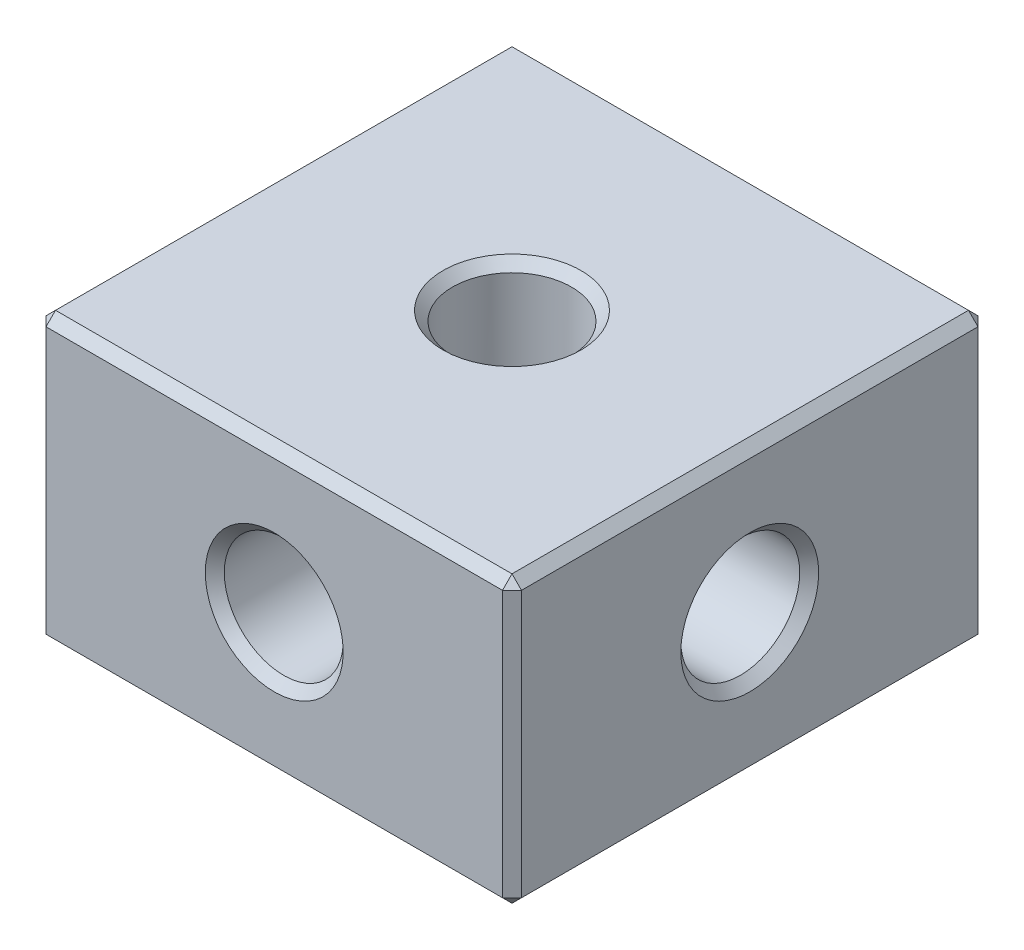
ISO-10303-21;
HEADER;
FILE_DESCRIPTION(('STEP AP214'),'2;1');
FILE_NAME('part.step','',(''),(''),'','','');
FILE_SCHEMA(('AUTOMOTIVE_DESIGN { 1 0 10303 214 1 1 1 1 }'));
ENDSEC;
DATA;
#1=APPLICATION_CONTEXT('core data for automotive mechanical design processes');
#2=APPLICATION_PROTOCOL_DEFINITION('international standard','automotive_design',2000,#1);
#3=PRODUCT_CONTEXT('',#1,'mechanical');
#4=PRODUCT('Part','Part','',(#3));
#5=PRODUCT_RELATED_PRODUCT_CATEGORY('part','',(#4));
#6=PRODUCT_DEFINITION_FORMATION('','',#4);
#7=PRODUCT_DEFINITION_CONTEXT('part definition',#1,'design');
#8=PRODUCT_DEFINITION('design','',#6,#7);
#9=PRODUCT_DEFINITION_SHAPE('','',#8);
#10=(LENGTH_UNIT() NAMED_UNIT(*) SI_UNIT(.MILLI.,.METRE.));
#11=(NAMED_UNIT(*) PLANE_ANGLE_UNIT() SI_UNIT($,.RADIAN.));
#12=(NAMED_UNIT(*) SI_UNIT($,.STERADIAN.) SOLID_ANGLE_UNIT());
#13=UNCERTAINTY_MEASURE_WITH_UNIT(LENGTH_MEASURE(1.E-05),#10,'distance_accuracy_value','');
#14=(GEOMETRIC_REPRESENTATION_CONTEXT(3) GLOBAL_UNCERTAINTY_ASSIGNED_CONTEXT((#13)) GLOBAL_UNIT_ASSIGNED_CONTEXT((#10,
#11,#12)) REPRESENTATION_CONTEXT('',''));
#15=CARTESIAN_POINT('',(0.,0.,0.));
#16=DIRECTION('',(0.,0.,1.));
#17=DIRECTION('',(1.,0.,0.));
#18=AXIS2_PLACEMENT_3D('',#15,#16,#17);
#19=CARTESIAN_POINT('',(0.,0.,5.));
#20=DIRECTION('',(0.,0.,1.));
#21=DIRECTION('',(1.,0.,0.));
#22=AXIS2_PLACEMENT_3D('',#19,#20,#21);
#23=CYLINDRICAL_SURFACE('',#22,1.25);
#24=CARTESIAN_POINT('',(0.,0.,4.8));
#25=DIRECTION('',(0.,0.,-1.));
#26=DIRECTION('',(-1.,0.,0.));
#27=AXIS2_PLACEMENT_3D('',#24,#25,#26);
#28=CIRCLE('',#27,1.25);
#29=CARTESIAN_POINT('',(-1.25,0.,4.8));
#30=VERTEX_POINT('',#29);
#31=EDGE_CURVE('E249',#30,#30,#28,.F.);
#32=ORIENTED_EDGE('',*,*,#31,.T.);
#33=EDGE_LOOP('',(#32));
#34=FACE_BOUND('',#33,.T.);
#35=CARTESIAN_POINT('',(0.,0.,0.));
#36=DIRECTION('',(0.,0.707106781186547,0.707106781186547));
#37=DIRECTION('',(0.,-0.707106781186547,0.707106781186547));
#38=AXIS2_PLACEMENT_3D('',#35,#36,#37);
#39=ELLIPSE('',#38,1.76776695296636,1.25);
#40=CARTESIAN_POINT('',(0.883883476483181,-0.883883476483181,0.883883476483181));
#41=VERTEX_POINT('',#40);
#42=CARTESIAN_POINT('',(-0.88388347648318,-0.88388347648318,0.88388347648318));
#43=VERTEX_POINT('',#42);
#44=EDGE_CURVE('E181',#41,#43,#39,.F.);
#45=ORIENTED_EDGE('',*,*,#44,.T.);
#46=CARTESIAN_POINT('',(0.,0.,0.));
#47=DIRECTION('',(0.707106781186548,0.,0.707106781186547));
#48=DIRECTION('',(-0.707106781186547,0.,0.707106781186547));
#49=AXIS2_PLACEMENT_3D('',#46,#47,#48);
#50=ELLIPSE('',#49,1.76776695296636,1.25);
#51=CARTESIAN_POINT('',(-0.88388347648318,0.88388347648318,0.88388347648318));
#52=VERTEX_POINT('',#51);
#53=EDGE_CURVE('E176',#43,#52,#50,.F.);
#54=ORIENTED_EDGE('',*,*,#53,.T.);
#55=CARTESIAN_POINT('',(0.,0.,0.));
#56=DIRECTION('',(0.,-0.707106781186547,0.707106781186547));
#57=DIRECTION('',(0.,0.707106781186547,0.707106781186547));
#58=AXIS2_PLACEMENT_3D('',#55,#56,#57);
#59=ELLIPSE('',#58,1.76776695296636,1.25);
#60=CARTESIAN_POINT('',(0.88388347648318,0.88388347648318,0.88388347648318));
#61=VERTEX_POINT('',#60);
#62=EDGE_CURVE('E175',#52,#61,#59,.F.);
#63=ORIENTED_EDGE('',*,*,#62,.T.);
#64=CARTESIAN_POINT('',(0.,0.,0.));
#65=DIRECTION('',(-0.707106781186547,0.,0.707106781186547));
#66=DIRECTION('',(0.707106781186548,0.,0.707106781186547));
#67=AXIS2_PLACEMENT_3D('',#64,#65,#66);
#68=ELLIPSE('',#67,1.76776695296636,1.25);
#69=EDGE_CURVE('E879',#61,#41,#68,.F.);
#70=ORIENTED_EDGE('',*,*,#69,.T.);
#71=EDGE_LOOP('',(#45,#54,#63,#70));
#72=FACE_BOUND('',#71,.T.);
#73=ADVANCED_FACE('F42',(#34,#72),#23,.F.);
#74=CARTESIAN_POINT('',(5.,3.,-5.));
#75=DIRECTION('',(-1.,0.,0.));
#76=DIRECTION('',(0.,0.,1.));
#77=AXIS2_PLACEMENT_3D('',#74,#75,#76);
#78=PLANE('',#77);
#79=CARTESIAN_POINT('',(5.,0.,0.));
#80=DIRECTION('',(-1.,0.,0.));
#81=DIRECTION('',(0.,0.,1.));
#82=AXIS2_PLACEMENT_3D('',#79,#80,#81);
#83=CIRCLE('',#82,1.44999999999999);
#84=CARTESIAN_POINT('',(5.,0.,1.44999999999999));
#85=VERTEX_POINT('',#84);
#86=EDGE_CURVE('E246',#85,#85,#83,.T.);
#87=ORIENTED_EDGE('',*,*,#86,.T.);
#88=EDGE_LOOP('',(#87));
#89=FACE_BOUND('',#88,.T.);
#90=DIRECTION('',(0.,0.,-1.));
#91=VECTOR('',#90,1.);
#92=CARTESIAN_POINT('',(5.,-2.8,-5.));
#93=LINE('',#92,#91);
#94=CARTESIAN_POINT('',(5.,-2.8,4.8));
#95=VERTEX_POINT('',#94);
#96=CARTESIAN_POINT('',(5.,-2.8,-4.8));
#97=VERTEX_POINT('',#96);
#98=EDGE_CURVE('E241',#95,#97,#93,.T.);
#99=ORIENTED_EDGE('',*,*,#98,.T.);
#100=DIRECTION('',(0.,1.,0.));
#101=VECTOR('',#100,1.);
#102=CARTESIAN_POINT('',(5.,3.,-4.8));
#103=LINE('',#102,#101);
#104=CARTESIAN_POINT('',(5.,2.8,-4.8));
#105=VERTEX_POINT('',#104);
#106=EDGE_CURVE('E243',#97,#105,#103,.T.);
#107=ORIENTED_EDGE('',*,*,#106,.T.);
#108=DIRECTION('',(0.,0.,1.));
#109=VECTOR('',#108,1.);
#110=CARTESIAN_POINT('',(5.,2.8,5.));
#111=LINE('',#110,#109);
#112=CARTESIAN_POINT('',(5.,2.8,4.8));
#113=VERTEX_POINT('',#112);
#114=EDGE_CURVE('E237',#105,#113,#111,.T.);
#115=ORIENTED_EDGE('',*,*,#114,.T.);
#116=DIRECTION('',(0.,-1.,0.));
#117=VECTOR('',#116,1.);
#118=CARTESIAN_POINT('',(5.,3.,4.8));
#119=LINE('',#118,#117);
#120=EDGE_CURVE('E239',#113,#95,#119,.T.);
#121=ORIENTED_EDGE('',*,*,#120,.T.);
#122=EDGE_LOOP('',(#99,#107,#115,#121));
#123=FACE_BOUND('',#122,.T.);
#124=ADVANCED_FACE('F350',(#89,#123),#78,.F.);
#125=CARTESIAN_POINT('',(-5.,3.,-5.));
#126=DIRECTION('',(0.,0.,1.));
#127=DIRECTION('',(1.,0.,0.));
#128=AXIS2_PLACEMENT_3D('',#125,#126,#127);
#129=PLANE('',#128);
#130=CARTESIAN_POINT('',(0.,0.,-5.));
#131=DIRECTION('',(0.,0.,1.));
#132=DIRECTION('',(1.,0.,0.));
#133=AXIS2_PLACEMENT_3D('',#130,#131,#132);
#134=CIRCLE('',#133,1.45);
#135=CARTESIAN_POINT('',(1.45,0.,-5.));
#136=VERTEX_POINT('',#135);
#137=EDGE_CURVE('E228',#136,#136,#134,.T.);
#138=ORIENTED_EDGE('',*,*,#137,.T.);
#139=EDGE_LOOP('',(#138));
#140=FACE_BOUND('',#139,.T.);
#141=DIRECTION('',(-1.,0.,0.));
#142=VECTOR('',#141,1.);
#143=CARTESIAN_POINT('',(-5.,-2.8,-5.));
#144=LINE('',#143,#142);
#145=CARTESIAN_POINT('',(4.8,-2.8,-5.));
#146=VERTEX_POINT('',#145);
#147=CARTESIAN_POINT('',(-4.8,-2.8,-5.));
#148=VERTEX_POINT('',#147);
#149=EDGE_CURVE('E223',#146,#148,#144,.T.);
#150=ORIENTED_EDGE('',*,*,#149,.T.);
#151=DIRECTION('',(0.,1.,0.));
#152=VECTOR('',#151,1.);
#153=CARTESIAN_POINT('',(-4.8,3.,-5.));
#154=LINE('',#153,#152);
#155=CARTESIAN_POINT('',(-4.8,2.8,-5.));
#156=VERTEX_POINT('',#155);
#157=EDGE_CURVE('E225',#148,#156,#154,.T.);
#158=ORIENTED_EDGE('',*,*,#157,.T.);
#159=DIRECTION('',(1.,0.,0.));
#160=VECTOR('',#159,1.);
#161=CARTESIAN_POINT('',(5.,2.8,-5.));
#162=LINE('',#161,#160);
#163=CARTESIAN_POINT('',(4.8,2.8,-5.));
#164=VERTEX_POINT('',#163);
#165=EDGE_CURVE('E219',#156,#164,#162,.T.);
#166=ORIENTED_EDGE('',*,*,#165,.T.);
#167=DIRECTION('',(0.,-1.,0.));
#168=VECTOR('',#167,1.);
#169=CARTESIAN_POINT('',(4.8,3.,-5.));
#170=LINE('',#169,#168);
#171=EDGE_CURVE('E221',#164,#146,#170,.T.);
#172=ORIENTED_EDGE('',*,*,#171,.T.);
#173=EDGE_LOOP('',(#150,#158,#166,#172));
#174=FACE_BOUND('',#173,.T.);
#175=ADVANCED_FACE('F371',(#140,#174),#129,.F.);
#176=CARTESIAN_POINT('',(-5.,3.,-5.));
#177=DIRECTION('',(1.,0.,0.));
#178=DIRECTION('',(0.,0.,-1.));
#179=AXIS2_PLACEMENT_3D('',#176,#177,#178);
#180=PLANE('',#179);
#181=CARTESIAN_POINT('',(-5.,0.,0.));
#182=DIRECTION('',(1.,0.,0.));
#183=DIRECTION('',(0.,0.,-1.));
#184=AXIS2_PLACEMENT_3D('',#181,#182,#183);
#185=CIRCLE('',#184,1.44999999999999);
#186=CARTESIAN_POINT('',(-5.,0.,-1.44999999999999));
#187=VERTEX_POINT('',#186);
#188=EDGE_CURVE('E213',#187,#187,#185,.T.);
#189=ORIENTED_EDGE('',*,*,#188,.T.);
#190=EDGE_LOOP('',(#189));
#191=FACE_BOUND('',#190,.T.);
#192=DIRECTION('',(0.,-1.,0.));
#193=VECTOR('',#192,1.);
#194=CARTESIAN_POINT('',(-5.,3.,-4.8));
#195=LINE('',#194,#193);
#196=CARTESIAN_POINT('',(-5.,2.8,-4.8));
#197=VERTEX_POINT('',#196);
#198=CARTESIAN_POINT('',(-5.,-2.8,-4.8));
#199=VERTEX_POINT('',#198);
#200=EDGE_CURVE('E208',#197,#199,#195,.T.);
#201=ORIENTED_EDGE('',*,*,#200,.T.);
#202=DIRECTION('',(0.,0.,1.));
#203=VECTOR('',#202,1.);
#204=CARTESIAN_POINT('',(-5.,-2.8,-5.));
#205=LINE('',#204,#203);
#206=CARTESIAN_POINT('',(-5.,-2.8,4.8));
#207=VERTEX_POINT('',#206);
#208=EDGE_CURVE('E210',#199,#207,#205,.T.);
#209=ORIENTED_EDGE('',*,*,#208,.T.);
#210=DIRECTION('',(0.,1.,0.));
#211=VECTOR('',#210,1.);
#212=CARTESIAN_POINT('',(-5.,3.,4.8));
#213=LINE('',#212,#211);
#214=CARTESIAN_POINT('',(-5.,2.8,4.8));
#215=VERTEX_POINT('',#214);
#216=EDGE_CURVE('E206',#207,#215,#213,.T.);
#217=ORIENTED_EDGE('',*,*,#216,.T.);
#218=DIRECTION('',(0.,0.,-1.));
#219=VECTOR('',#218,1.);
#220=CARTESIAN_POINT('',(-5.,2.8,-5.));
#221=LINE('',#220,#219);
#222=EDGE_CURVE('E204',#215,#197,#221,.T.);
#223=ORIENTED_EDGE('',*,*,#222,.T.);
#224=EDGE_LOOP('',(#201,#209,#217,#223));
#225=FACE_BOUND('',#224,.T.);
#226=ADVANCED_FACE('F432',(#191,#225),#180,.F.);
#227=CARTESIAN_POINT('',(-5.,3.,5.));
#228=DIRECTION('',(0.,0.,-1.));
#229=DIRECTION('',(-1.,0.,0.));
#230=AXIS2_PLACEMENT_3D('',#227,#228,#229);
#231=PLANE('',#230);
#232=CARTESIAN_POINT('',(0.,0.,5.));
#233=DIRECTION('',(0.,0.,-1.));
#234=DIRECTION('',(-1.,0.,0.));
#235=AXIS2_PLACEMENT_3D('',#232,#233,#234);
#236=CIRCLE('',#235,1.45);
#237=CARTESIAN_POINT('',(-1.45,0.,5.));
#238=VERTEX_POINT('',#237);
#239=EDGE_CURVE('E261',#238,#238,#236,.T.);
#240=ORIENTED_EDGE('',*,*,#239,.T.);
#241=EDGE_LOOP('',(#240));
#242=FACE_BOUND('',#241,.T.);
#243=DIRECTION('',(-1.,0.,0.));
#244=VECTOR('',#243,1.);
#245=CARTESIAN_POINT('',(-5.,2.8,5.));
#246=LINE('',#245,#244);
#247=CARTESIAN_POINT('',(4.8,2.8,5.));
#248=VERTEX_POINT('',#247);
#249=CARTESIAN_POINT('',(-4.8,2.8,5.));
#250=VERTEX_POINT('',#249);
#251=EDGE_CURVE('E252',#248,#250,#246,.T.);
#252=ORIENTED_EDGE('',*,*,#251,.T.);
#253=DIRECTION('',(0.,-1.,0.));
#254=VECTOR('',#253,1.);
#255=CARTESIAN_POINT('',(-4.8,3.,5.));
#256=LINE('',#255,#254);
#257=CARTESIAN_POINT('',(-4.8,-2.8,5.));
#258=VERTEX_POINT('',#257);
#259=EDGE_CURVE('E258',#250,#258,#256,.T.);
#260=ORIENTED_EDGE('',*,*,#259,.T.);
#261=DIRECTION('',(1.,0.,0.));
#262=VECTOR('',#261,1.);
#263=CARTESIAN_POINT('',(-5.,-2.8,5.));
#264=LINE('',#263,#262);
#265=CARTESIAN_POINT('',(4.8,-2.8,5.));
#266=VERTEX_POINT('',#265);
#267=EDGE_CURVE('E256',#258,#266,#264,.T.);
#268=ORIENTED_EDGE('',*,*,#267,.T.);
#269=DIRECTION('',(0.,1.,0.));
#270=VECTOR('',#269,1.);
#271=CARTESIAN_POINT('',(4.8,3.,5.));
#272=LINE('',#271,#270);
#273=EDGE_CURVE('E254',#266,#248,#272,.T.);
#274=ORIENTED_EDGE('',*,*,#273,.T.);
#275=EDGE_LOOP('',(#252,#260,#268,#274));
#276=FACE_BOUND('',#275,.T.);
#277=ADVANCED_FACE('F437',(#242,#276),#231,.F.);
#278=CARTESIAN_POINT('',(0.,3.,0.));
#279=DIRECTION('',(0.,1.,0.));
#280=DIRECTION('',(0.,0.,1.));
#281=AXIS2_PLACEMENT_3D('',#278,#279,#280);
#282=PLANE('',#281);
#283=DIRECTION('',(0.,0.,1.));
#284=VECTOR('',#283,1.);
#285=CARTESIAN_POINT('',(-4.8,3.,5.));
#286=LINE('',#285,#284);
#287=CARTESIAN_POINT('',(-4.80000000000001,3.,-4.8));
#288=VERTEX_POINT('',#287);
#289=CARTESIAN_POINT('',(-4.8,3.,4.8));
#290=VERTEX_POINT('',#289);
#291=EDGE_CURVE('E60',#288,#290,#286,.T.);
#292=ORIENTED_EDGE('',*,*,#291,.T.);
#293=DIRECTION('',(1.,0.,0.));
#294=VECTOR('',#293,1.);
#295=CARTESIAN_POINT('',(5.,3.,4.8));
#296=LINE('',#295,#294);
#297=CARTESIAN_POINT('',(4.8,3.,4.8));
#298=VERTEX_POINT('',#297);
#299=EDGE_CURVE('E52',#290,#298,#296,.T.);
#300=ORIENTED_EDGE('',*,*,#299,.T.);
#301=DIRECTION('',(0.,0.,-1.));
#302=VECTOR('',#301,1.);
#303=CARTESIAN_POINT('',(4.8,3.,-5.));
#304=LINE('',#303,#302);
#305=CARTESIAN_POINT('',(4.8,3.,-4.8));
#306=VERTEX_POINT('',#305);
#307=EDGE_CURVE('E267',#298,#306,#304,.T.);
#308=ORIENTED_EDGE('',*,*,#307,.T.);
#309=DIRECTION('',(-1.,0.,0.));
#310=VECTOR('',#309,1.);
#311=CARTESIAN_POINT('',(-5.,3.,-4.8));
#312=LINE('',#311,#310);
#313=EDGE_CURVE('E65',#306,#288,#312,.T.);
#314=ORIENTED_EDGE('',*,*,#313,.T.);
#315=EDGE_LOOP('',(#292,#300,#308,#314));
#316=FACE_BOUND('',#315,.T.);
#317=CARTESIAN_POINT('',(0.,3.,0.));
#318=DIRECTION('',(0.,1.,0.));
#319=DIRECTION('',(0.,0.,1.));
#320=AXIS2_PLACEMENT_3D('',#317,#318,#319);
#321=CIRCLE('',#320,1.44999999999999);
#322=CARTESIAN_POINT('',(0.,3.,1.44999999999999));
#323=VERTEX_POINT('',#322);
#324=EDGE_CURVE('E264',#323,#323,#321,.F.);
#325=ORIENTED_EDGE('',*,*,#324,.T.);
#326=EDGE_LOOP('',(#325));
#327=FACE_BOUND('',#326,.T.);
#328=ADVANCED_FACE('F418',(#316,#327),#282,.T.);
#329=CARTESIAN_POINT('',(0.,-3.,0.));
#330=DIRECTION('',(0.,1.,0.));
#331=DIRECTION('',(0.,0.,1.));
#332=AXIS2_PLACEMENT_3D('',#329,#330,#331);
#333=PLANE('',#332);
#334=CARTESIAN_POINT('',(0.,-3.,0.));
#335=DIRECTION('',(0.,1.,0.));
#336=DIRECTION('',(0.,0.,1.));
#337=AXIS2_PLACEMENT_3D('',#334,#335,#336);
#338=CIRCLE('',#337,1.45);
#339=CARTESIAN_POINT('',(0.,-3.,-1.45));
#340=VERTEX_POINT('',#339);
#341=EDGE_CURVE('E198',#340,#340,#338,.T.);
#342=ORIENTED_EDGE('',*,*,#341,.T.);
#343=EDGE_LOOP('',(#342));
#344=FACE_BOUND('',#343,.T.);
#345=DIRECTION('',(-1.,0.,0.));
#346=VECTOR('',#345,1.);
#347=CARTESIAN_POINT('',(0.,-3.,4.8));
#348=LINE('',#347,#346);
#349=CARTESIAN_POINT('',(4.8,-3.,4.8));
#350=VERTEX_POINT('',#349);
#351=CARTESIAN_POINT('',(-4.8,-3.,4.8));
#352=VERTEX_POINT('',#351);
#353=EDGE_CURVE('E185',#350,#352,#348,.T.);
#354=ORIENTED_EDGE('',*,*,#353,.T.);
#355=DIRECTION('',(0.,0.,-1.));
#356=VECTOR('',#355,1.);
#357=CARTESIAN_POINT('',(-4.8,-3.,0.));
#358=LINE('',#357,#356);
#359=CARTESIAN_POINT('',(-4.8,-3.,-4.8));
#360=VERTEX_POINT('',#359);
#361=EDGE_CURVE('E195',#352,#360,#358,.T.);
#362=ORIENTED_EDGE('',*,*,#361,.T.);
#363=DIRECTION('',(1.,0.,0.));
#364=VECTOR('',#363,1.);
#365=CARTESIAN_POINT('',(0.,-3.,-4.8));
#366=LINE('',#365,#364);
#367=CARTESIAN_POINT('',(4.8,-3.,-4.8));
#368=VERTEX_POINT('',#367);
#369=EDGE_CURVE('E193',#360,#368,#366,.T.);
#370=ORIENTED_EDGE('',*,*,#369,.T.);
#371=DIRECTION('',(0.,0.,1.));
#372=VECTOR('',#371,1.);
#373=CARTESIAN_POINT('',(4.8,-3.,0.));
#374=LINE('',#373,#372);
#375=EDGE_CURVE('E191',#368,#350,#374,.T.);
#376=ORIENTED_EDGE('',*,*,#375,.T.);
#377=EDGE_LOOP('',(#354,#362,#370,#376));
#378=FACE_BOUND('',#377,.T.);
#379=ADVANCED_FACE('F410',(#344,#378),#333,.F.);
#380=CARTESIAN_POINT('',(0.,0.,-4.8));
#381=DIRECTION('',(0.,0.,1.));
#382=DIRECTION('',(1.,0.,0.));
#383=AXIS2_PLACEMENT_3D('',#380,#381,#382);
#384=CIRCLE('',#383,1.25);
#385=CARTESIAN_POINT('',(1.25,0.,-4.8));
#386=VERTEX_POINT('',#385);
#387=EDGE_CURVE('E231',#386,#386,#384,.F.);
#388=ORIENTED_EDGE('',*,*,#387,.T.);
#389=EDGE_LOOP('',(#388));
#390=FACE_BOUND('',#389,.T.);
#391=CARTESIAN_POINT('',(0.,0.,0.));
#392=DIRECTION('',(0.,-0.707106781186547,0.707106781186547));
#393=DIRECTION('',(0.,0.707106781186547,0.707106781186547));
#394=AXIS2_PLACEMENT_3D('',#391,#392,#393);
#395=ELLIPSE('',#394,1.76776695296636,1.25);
#396=CARTESIAN_POINT('',(-0.883883476483181,-0.883883476483181,-0.883883476483181));
#397=VERTEX_POINT('',#396);
#398=CARTESIAN_POINT('',(0.883883476483181,-0.883883476483181,-0.883883476483181));
#399=VERTEX_POINT('',#398);
#400=EDGE_CURVE('E182',#397,#399,#395,.T.);
#401=ORIENTED_EDGE('',*,*,#400,.T.);
#402=CARTESIAN_POINT('',(0.,0.,0.));
#403=DIRECTION('',(0.707106781186548,0.,0.707106781186547));
#404=DIRECTION('',(-0.707106781186547,0.,0.707106781186547));
#405=AXIS2_PLACEMENT_3D('',#402,#403,#404);
#406=ELLIPSE('',#405,1.76776695296636,1.25);
#407=CARTESIAN_POINT('',(0.88388347648318,0.88388347648318,-0.88388347648318));
#408=VERTEX_POINT('',#407);
#409=EDGE_CURVE('E180',#399,#408,#406,.T.);
#410=ORIENTED_EDGE('',*,*,#409,.T.);
#411=CARTESIAN_POINT('',(0.,0.,0.));
#412=DIRECTION('',(0.,0.707106781186547,0.707106781186547));
#413=DIRECTION('',(0.,-0.707106781186547,0.707106781186547));
#414=AXIS2_PLACEMENT_3D('',#411,#412,#413);
#415=ELLIPSE('',#414,1.76776695296636,1.25);
#416=CARTESIAN_POINT('',(-0.883883476483181,0.883883476483181,-0.883883476483181));
#417=VERTEX_POINT('',#416);
#418=EDGE_CURVE('E173',#408,#417,#415,.T.);
#419=ORIENTED_EDGE('',*,*,#418,.T.);
#420=CARTESIAN_POINT('',(0.,0.,0.));
#421=DIRECTION('',(-0.707106781186547,0.,0.707106781186547));
#422=DIRECTION('',(0.707106781186548,0.,0.707106781186547));
#423=AXIS2_PLACEMENT_3D('',#420,#421,#422);
#424=ELLIPSE('',#423,1.76776695296636,1.25);
#425=EDGE_CURVE('E156',#417,#397,#424,.T.);
#426=ORIENTED_EDGE('',*,*,#425,.T.);
#427=EDGE_LOOP('',(#401,#410,#419,#426));
#428=FACE_BOUND('',#427,.T.);
#429=ADVANCED_FACE('F179',(#390,#428),#23,.F.);
#430=CARTESIAN_POINT('',(0.,3.,0.));
#431=DIRECTION('',(0.,1.,0.));
#432=DIRECTION('',(0.,0.,1.));
#433=AXIS2_PLACEMENT_3D('',#430,#431,#432);
#434=CYLINDRICAL_SURFACE('',#433,1.24999999999999);
#435=CARTESIAN_POINT('',(0.,2.80000000000001,0.));
#436=DIRECTION('',(0.,1.,0.));
#437=DIRECTION('',(0.,0.,1.));
#438=AXIS2_PLACEMENT_3D('',#435,#436,#437);
#439=CIRCLE('',#438,1.24999999999999);
#440=CARTESIAN_POINT('',(0.,2.80000000000001,1.24999999999999));
#441=VERTEX_POINT('',#440);
#442=EDGE_CURVE('E11',#441,#441,#439,.T.);
#443=ORIENTED_EDGE('',*,*,#442,.T.);
#444=EDGE_LOOP('',(#443));
#445=FACE_BOUND('',#444,.T.);
#446=ORIENTED_EDGE('',*,*,#62,.F.);
#447=CARTESIAN_POINT('',(0.,0.,0.));
#448=DIRECTION('',(0.707106781186547,0.707106781186547,0.));
#449=DIRECTION('',(-0.707106781186547,0.707106781186547,0.));
#450=AXIS2_PLACEMENT_3D('',#447,#448,#449);
#451=ELLIPSE('',#450,1.76776695296636,1.24999999999999);
#452=EDGE_CURVE('E159',#52,#417,#451,.F.);
#453=ORIENTED_EDGE('',*,*,#452,.T.);
#454=ORIENTED_EDGE('',*,*,#418,.F.);
#455=CARTESIAN_POINT('',(0.,0.,0.));
#456=DIRECTION('',(-0.707106781186547,0.707106781186547,0.));
#457=DIRECTION('',(0.707106781186547,0.707106781186547,0.));
#458=AXIS2_PLACEMENT_3D('',#455,#456,#457);
#459=ELLIPSE('',#458,1.76776695296636,1.24999999999999);
#460=EDGE_CURVE('E880',#408,#61,#459,.F.);
#461=ORIENTED_EDGE('',*,*,#460,.T.);
#462=EDGE_LOOP('',(#446,#453,#454,#461));
#463=FACE_BOUND('',#462,.T.);
#464=ADVANCED_FACE('F171',(#445,#463),#434,.F.);
#465=CARTESIAN_POINT('',(0.,-2.8,0.));
#466=DIRECTION('',(0.,1.,0.));
#467=DIRECTION('',(0.,0.,1.));
#468=AXIS2_PLACEMENT_3D('',#465,#466,#467);
#469=CIRCLE('',#468,1.24999999999999);
#470=CARTESIAN_POINT('',(0.,-2.8,-1.24999999999999));
#471=VERTEX_POINT('',#470);
#472=EDGE_CURVE('E201',#471,#471,#469,.F.);
#473=ORIENTED_EDGE('',*,*,#472,.T.);
#474=EDGE_LOOP('',(#473));
#475=FACE_BOUND('',#474,.T.);
#476=ORIENTED_EDGE('',*,*,#44,.F.);
#477=CARTESIAN_POINT('',(0.,0.,0.));
#478=DIRECTION('',(0.707106781186547,0.707106781186547,0.));
#479=DIRECTION('',(-0.707106781186547,0.707106781186547,0.));
#480=AXIS2_PLACEMENT_3D('',#477,#478,#479);
#481=ELLIPSE('',#480,1.76776695296636,1.24999999999999);
#482=EDGE_CURVE('E882',#41,#399,#481,.T.);
#483=ORIENTED_EDGE('',*,*,#482,.T.);
#484=ORIENTED_EDGE('',*,*,#400,.F.);
#485=CARTESIAN_POINT('',(0.,0.,0.));
#486=DIRECTION('',(-0.707106781186547,0.707106781186547,0.));
#487=DIRECTION('',(0.707106781186547,0.707106781186547,0.));
#488=AXIS2_PLACEMENT_3D('',#485,#486,#487);
#489=ELLIPSE('',#488,1.76776695296636,1.24999999999999);
#490=EDGE_CURVE('E162',#397,#43,#489,.T.);
#491=ORIENTED_EDGE('',*,*,#490,.T.);
#492=EDGE_LOOP('',(#476,#483,#484,#491));
#493=FACE_BOUND('',#492,.T.);
#494=ADVANCED_FACE('F416',(#475,#493),#434,.F.);
#495=CARTESIAN_POINT('',(5.,0.,0.));
#496=DIRECTION('',(1.,0.,0.));
#497=DIRECTION('',(0.,0.,-1.));
#498=AXIS2_PLACEMENT_3D('',#495,#496,#497);
#499=CYLINDRICAL_SURFACE('',#498,1.24999999999999);
#500=CARTESIAN_POINT('',(-4.8,0.,0.));
#501=DIRECTION('',(1.,0.,0.));
#502=DIRECTION('',(0.,0.,-1.));
#503=AXIS2_PLACEMENT_3D('',#500,#501,#502);
#504=CIRCLE('',#503,1.24999999999999);
#505=CARTESIAN_POINT('',(-4.8,0.,-1.24999999999999));
#506=VERTEX_POINT('',#505);
#507=EDGE_CURVE('E216',#506,#506,#504,.F.);
#508=ORIENTED_EDGE('',*,*,#507,.T.);
#509=EDGE_LOOP('',(#508));
#510=FACE_BOUND('',#509,.T.);
#511=ORIENTED_EDGE('',*,*,#490,.F.);
#512=ORIENTED_EDGE('',*,*,#425,.F.);
#513=ORIENTED_EDGE('',*,*,#452,.F.);
#514=ORIENTED_EDGE('',*,*,#53,.F.);
#515=EDGE_LOOP('',(#511,#512,#513,#514));
#516=FACE_BOUND('',#515,.T.);
#517=ADVANCED_FACE('F158',(#510,#516),#499,.F.);
#518=CARTESIAN_POINT('',(4.80000000000001,0.,0.));
#519=DIRECTION('',(-1.,0.,0.));
#520=DIRECTION('',(0.,0.,1.));
#521=AXIS2_PLACEMENT_3D('',#518,#519,#520);
#522=CIRCLE('',#521,1.24999999999999);
#523=CARTESIAN_POINT('',(4.80000000000001,0.,1.24999999999999));
#524=VERTEX_POINT('',#523);
#525=EDGE_CURVE('E234',#524,#524,#522,.F.);
#526=ORIENTED_EDGE('',*,*,#525,.T.);
#527=EDGE_LOOP('',(#526));
#528=FACE_BOUND('',#527,.T.);
#529=ORIENTED_EDGE('',*,*,#69,.F.);
#530=ORIENTED_EDGE('',*,*,#460,.F.);
#531=ORIENTED_EDGE('',*,*,#409,.F.);
#532=ORIENTED_EDGE('',*,*,#482,.F.);
#533=EDGE_LOOP('',(#529,#530,#531,#532));
#534=FACE_BOUND('',#533,.T.);
#535=ADVANCED_FACE('F449',(#528,#534),#499,.F.);
#536=CARTESIAN_POINT('',(0.,-3.,0.));
#537=DIRECTION('',(0.,-1.,0.));
#538=DIRECTION('',(0.,0.,-1.));
#539=AXIS2_PLACEMENT_3D('',#536,#537,#538);
#540=CONICAL_SURFACE('',#539,1.45,0.785398163397445);
#541=CARTESIAN_POINT('',(0.,-2.8,-1.24999999999999));
#542=CARTESIAN_POINT('',(0.,-2.80208333333333,-1.25208333333333));
#543=CARTESIAN_POINT('',(0.,-2.80416666666666,-1.25416666666666));
#544=CARTESIAN_POINT('',(0.,-2.80833333333333,-1.25833333333333));
#545=CARTESIAN_POINT('',(0.,-2.81041666666666,-1.26041666666666));
#546=CARTESIAN_POINT('',(0.,-2.81458333333333,-1.26458333333333));
#547=CARTESIAN_POINT('',(0.,-2.81666666666666,-1.26666666666666));
#548=CARTESIAN_POINT('',(0.,-2.82083333333333,-1.27083333333333));
#549=CARTESIAN_POINT('',(0.,-2.82291666666666,-1.27291666666666));
#550=CARTESIAN_POINT('',(0.,-2.82708333333333,-1.27708333333333));
#551=CARTESIAN_POINT('',(0.,-2.82916666666666,-1.27916666666666));
#552=CARTESIAN_POINT('',(0.,-2.83333333333333,-1.28333333333333));
#553=CARTESIAN_POINT('',(0.,-2.83541666666666,-1.28541666666666));
#554=CARTESIAN_POINT('',(0.,-2.83958333333333,-1.28958333333333));
#555=CARTESIAN_POINT('',(0.,-2.84166666666666,-1.29166666666666));
#556=CARTESIAN_POINT('',(0.,-2.84583333333333,-1.29583333333333));
#557=CARTESIAN_POINT('',(0.,-2.84791666666666,-1.29791666666666));
#558=CARTESIAN_POINT('',(0.,-2.85208333333333,-1.30208333333333));
#559=CARTESIAN_POINT('',(0.,-2.85416666666666,-1.30416666666666));
#560=CARTESIAN_POINT('',(0.,-2.85833333333333,-1.30833333333333));
#561=CARTESIAN_POINT('',(0.,-2.86041666666666,-1.31041666666666));
#562=CARTESIAN_POINT('',(0.,-2.86458333333333,-1.31458333333333));
#563=CARTESIAN_POINT('',(0.,-2.86666666666666,-1.31666666666666));
#564=CARTESIAN_POINT('',(0.,-2.87083333333333,-1.32083333333333));
#565=CARTESIAN_POINT('',(0.,-2.87291666666666,-1.32291666666666));
#566=CARTESIAN_POINT('',(0.,-2.87708333333333,-1.32708333333333));
#567=CARTESIAN_POINT('',(0.,-2.87916666666666,-1.32916666666666));
#568=CARTESIAN_POINT('',(0.,-2.88333333333333,-1.33333333333333));
#569=CARTESIAN_POINT('',(0.,-2.88541666666666,-1.33541666666666));
#570=CARTESIAN_POINT('',(0.,-2.88958333333333,-1.33958333333333));
#571=CARTESIAN_POINT('',(0.,-2.89166666666666,-1.34166666666666));
#572=CARTESIAN_POINT('',(0.,-2.89583333333333,-1.34583333333333));
#573=CARTESIAN_POINT('',(0.,-2.89791666666666,-1.34791666666666));
#574=CARTESIAN_POINT('',(0.,-2.90208333333333,-1.35208333333333));
#575=CARTESIAN_POINT('',(0.,-2.90416666666666,-1.35416666666666));
#576=CARTESIAN_POINT('',(0.,-2.90833333333333,-1.35833333333333));
#577=CARTESIAN_POINT('',(0.,-2.91041666666666,-1.36041666666666));
#578=CARTESIAN_POINT('',(0.,-2.91458333333333,-1.36458333333333));
#579=CARTESIAN_POINT('',(0.,-2.91666666666666,-1.36666666666666));
#580=CARTESIAN_POINT('',(0.,-2.92083333333333,-1.37083333333333));
#581=CARTESIAN_POINT('',(0.,-2.92291666666666,-1.37291666666666));
#582=CARTESIAN_POINT('',(0.,-2.92708333333333,-1.37708333333333));
#583=CARTESIAN_POINT('',(0.,-2.92916666666666,-1.37916666666666));
#584=CARTESIAN_POINT('',(0.,-2.93333333333333,-1.38333333333333));
#585=CARTESIAN_POINT('',(0.,-2.93541666666667,-1.38541666666666));
#586=CARTESIAN_POINT('',(0.,-2.93958333333333,-1.38958333333333));
#587=CARTESIAN_POINT('',(0.,-2.94166666666667,-1.39166666666666));
#588=CARTESIAN_POINT('',(0.,-2.94583333333333,-1.39583333333333));
#589=CARTESIAN_POINT('',(0.,-2.94791666666667,-1.39791666666666));
#590=CARTESIAN_POINT('',(0.,-2.95208333333333,-1.40208333333333));
#591=CARTESIAN_POINT('',(0.,-2.95416666666667,-1.40416666666666));
#592=CARTESIAN_POINT('',(0.,-2.95833333333333,-1.40833333333333));
#593=CARTESIAN_POINT('',(0.,-2.96041666666667,-1.41041666666666));
#594=CARTESIAN_POINT('',(0.,-2.96458333333333,-1.41458333333333));
#595=CARTESIAN_POINT('',(0.,-2.96666666666667,-1.41666666666666));
#596=CARTESIAN_POINT('',(0.,-2.97083333333333,-1.42083333333333));
#597=CARTESIAN_POINT('',(0.,-2.97291666666667,-1.42291666666666));
#598=CARTESIAN_POINT('',(0.,-2.97708333333333,-1.42708333333333));
#599=CARTESIAN_POINT('',(0.,-2.97916666666667,-1.42916666666666));
#600=CARTESIAN_POINT('',(0.,-2.98333333333333,-1.43333333333333));
#601=CARTESIAN_POINT('',(0.,-2.98541666666667,-1.43541666666666));
#602=CARTESIAN_POINT('',(0.,-2.98958333333333,-1.43958333333333));
#603=CARTESIAN_POINT('',(0.,-2.99166666666667,-1.44166666666666));
#604=CARTESIAN_POINT('',(0.,-2.99583333333333,-1.44583333333333));
#605=CARTESIAN_POINT('',(0.,-2.99791666666667,-1.44791666666666));
#606=CARTESIAN_POINT('',(0.,-3.,-1.45));
#607=B_SPLINE_CURVE_WITH_KNOTS('',3,(#541,#542,#543,#544,#545,#546,#547,#548,#549,#550,#551,
#552,#553,#554,#555,#556,#557,#558,#559,#560,#561,#562,#563,#564,#565,#566,#567,#568,#569,#570,
#571,#572,#573,#574,#575,#576,#577,#578,#579,#580,#581,#582,#583,#584,#585,#586,#587,#588,#589,
#590,#591,#592,#593,#594,#595,#596,#597,#598,#599,#600,#601,#602,#603,#604,#605,#606),
.UNSPECIFIED.,.F.,.F.,(4,2,2,2,2,2,2,2,2,2,2,2,2,2,2,2,2,2,2,2,2,2,2,2,2,2,2,2,2,2,2,2,4),(0.,
0.00883883476483179,0.0176776695296637,0.0265165042944958,0.0353553390593279,0.0441941738241599,
0.053033008588992,0.0618718433538241,0.070710678118656,0.0795495128834881,0.0883883476483202,
0.0972271824131523,0.106066017177984,0.114904851942816,0.123743686707648,0.13258252147248,
0.141421356237313,0.150260191002144,0.159099025766976,0.167937860531808,0.17677669529664,
0.185615530061472,0.194454364826304,0.203293199591137,0.212132034355969,0.220970869120801,
0.229809703885633,0.238648538650465,0.247487373415297,0.256326208180129,0.265165042944961,
0.274003877709793,0.282842712474625),.UNSPECIFIED.);
#608=EDGE_CURVE('BSEAM443',#471,#340,#607,.T.);
#609=ORIENTED_EDGE('',*,*,#472,.F.);
#610=ORIENTED_EDGE('',*,*,#341,.F.);
#611=ORIENTED_EDGE('',*,*,#608,.T.);
#612=ORIENTED_EDGE('',*,*,#608,.F.);
#613=EDGE_LOOP('',(#609,#611,#610,#612));
#614=FACE_BOUND('',#613,.T.);
#615=ADVANCED_FACE('F443',(#614),#540,.F.);
#616=CARTESIAN_POINT('',(-5.,0.,0.));
#617=DIRECTION('',(-1.,0.,0.));
#618=DIRECTION('',(0.,0.,1.));
#619=AXIS2_PLACEMENT_3D('',#616,#617,#618);
#620=CONICAL_SURFACE('',#619,1.44999999999999,0.785398163397447);
#621=ORIENTED_EDGE('',*,*,#507,.F.);
#622=EDGE_LOOP('',(#621));
#623=FACE_BOUND('',#622,.T.);
#624=ORIENTED_EDGE('',*,*,#188,.F.);
#625=EDGE_LOOP('',(#624));
#626=FACE_BOUND('',#625,.T.);
#627=ADVANCED_FACE('F427',(#623,#626),#620,.F.);
#628=CARTESIAN_POINT('',(0.,0.,-5.));
#629=DIRECTION('',(0.,0.,-1.));
#630=DIRECTION('',(-1.,0.,0.));
#631=AXIS2_PLACEMENT_3D('',#628,#629,#630);
#632=CONICAL_SURFACE('',#631,1.45,0.785398163397445);
#633=ORIENTED_EDGE('',*,*,#387,.F.);
#634=EDGE_LOOP('',(#633));
#635=FACE_BOUND('',#634,.T.);
#636=ORIENTED_EDGE('',*,*,#137,.F.);
#637=EDGE_LOOP('',(#636));
#638=FACE_BOUND('',#637,.T.);
#639=ADVANCED_FACE('F423',(#635,#638),#632,.F.);
#640=CARTESIAN_POINT('',(4.80000000000001,0.,0.));
#641=DIRECTION('',(1.,0.,0.));
#642=DIRECTION('',(0.,0.,-1.));
#643=AXIS2_PLACEMENT_3D('',#640,#641,#642);
#644=CONICAL_SURFACE('',#643,1.24999999999999,0.78539816339745);
#645=ORIENTED_EDGE('',*,*,#86,.F.);
#646=EDGE_LOOP('',(#645));
#647=FACE_BOUND('',#646,.T.);
#648=ORIENTED_EDGE('',*,*,#525,.F.);
#649=EDGE_LOOP('',(#648));
#650=FACE_BOUND('',#649,.T.);
#651=ADVANCED_FACE('F426',(#647,#650),#644,.F.);
#652=CARTESIAN_POINT('',(0.,0.,4.8));
#653=DIRECTION('',(0.,0.,1.));
#654=DIRECTION('',(1.,0.,0.));
#655=AXIS2_PLACEMENT_3D('',#652,#653,#654);
#656=CONICAL_SURFACE('',#655,1.25,0.785398163397454);
#657=ORIENTED_EDGE('',*,*,#239,.F.);
#658=EDGE_LOOP('',(#657));
#659=FACE_BOUND('',#658,.T.);
#660=ORIENTED_EDGE('',*,*,#31,.F.);
#661=EDGE_LOOP('',(#660));
#662=FACE_BOUND('',#661,.T.);
#663=ADVANCED_FACE('F465',(#659,#662),#656,.F.);
#664=CARTESIAN_POINT('',(4.8,3.,0.));
#665=DIRECTION('',(0.707106781186551,0.707106781186544,0.));
#666=DIRECTION('',(0.,0.,1.));
#667=AXIS2_PLACEMENT_3D('',#664,#665,#666);
#668=PLANE('',#667);
#669=DIRECTION('',(0.707106781186544,-0.707106781186551,0.));
#670=VECTOR('',#669,1.);
#671=CARTESIAN_POINT('',(5.,2.8,-4.8));
#672=LINE('',#671,#670);
#673=EDGE_CURVE('E47',#306,#105,#672,.T.);
#674=ORIENTED_EDGE('',*,*,#673,.F.);
#675=ORIENTED_EDGE('',*,*,#307,.F.);
#676=DIRECTION('',(-0.707106781186544,0.707106781186551,0.));
#677=VECTOR('',#676,1.);
#678=CARTESIAN_POINT('',(4.9,2.9,4.8));
#679=LINE('',#678,#677);
#680=EDGE_CURVE('E331',#113,#298,#679,.T.);
#681=ORIENTED_EDGE('',*,*,#680,.F.);
#682=ORIENTED_EDGE('',*,*,#114,.F.);
#683=EDGE_LOOP('',(#674,#675,#681,#682));
#684=FACE_BOUND('',#683,.T.);
#685=ADVANCED_FACE('F347',(#684),#668,.T.);
#686=CARTESIAN_POINT('',(5.,2.8,-4.8));
#687=DIRECTION('',(0.577350269189633,0.57735026918962,-0.577350269189625));
#688=DIRECTION('',(-0.707106781186543,0.,-0.707106781186552));
#689=AXIS2_PLACEMENT_3D('',#686,#687,#688);
#690=PLANE('',#689);
#691=DIRECTION('',(0.,0.707106781186551,0.707106781186544));
#692=VECTOR('',#691,1.);
#693=CARTESIAN_POINT('',(4.8,2.9,-4.9));
#694=LINE('',#693,#692);
#695=EDGE_CURVE('E327',#306,#164,#694,.F.);
#696=ORIENTED_EDGE('',*,*,#695,.F.);
#697=ORIENTED_EDGE('',*,*,#673,.T.);
#698=DIRECTION('',(0.707106781186543,0.,0.707106781186552));
#699=VECTOR('',#698,1.);
#700=CARTESIAN_POINT('',(5.,2.8,-4.8));
#701=LINE('',#700,#699);
#702=EDGE_CURVE('E330',#164,#105,#701,.T.);
#703=ORIENTED_EDGE('',*,*,#702,.F.);
#704=EDGE_LOOP('',(#696,#697,#703));
#705=FACE_BOUND('',#704,.T.);
#706=ADVANCED_FACE('F344',(#705),#690,.T.);
#707=CARTESIAN_POINT('',(4.8,2.8,5.));
#708=DIRECTION('',(0.577350269189631,0.577350269189618,0.577350269189628));
#709=DIRECTION('',(0.707106781186546,0.,-0.707106781186549));
#710=AXIS2_PLACEMENT_3D('',#707,#708,#709);
#711=PLANE('',#710);
#712=DIRECTION('',(-0.707106781186546,0.,0.707106781186549));
#713=VECTOR('',#712,1.);
#714=CARTESIAN_POINT('',(4.8,2.8,5.));
#715=LINE('',#714,#713);
#716=EDGE_CURVE('E322',#113,#248,#715,.T.);
#717=ORIENTED_EDGE('',*,*,#716,.F.);
#718=ORIENTED_EDGE('',*,*,#680,.T.);
#719=DIRECTION('',(0.,-0.707106781186551,0.707106781186544));
#720=VECTOR('',#719,1.);
#721=CARTESIAN_POINT('',(4.8,2.8,5.));
#722=LINE('',#721,#720);
#723=EDGE_CURVE('E325',#248,#298,#722,.F.);
#724=ORIENTED_EDGE('',*,*,#723,.F.);
#725=EDGE_LOOP('',(#717,#718,#724));
#726=FACE_BOUND('',#725,.T.);
#727=ADVANCED_FACE('F395',(#726),#711,.T.);
#728=CARTESIAN_POINT('',(4.8,3.,-5.));
#729=DIRECTION('',(-0.707106781186552,0.,0.707106781186543));
#730=DIRECTION('',(0.,-1.,0.));
#731=AXIS2_PLACEMENT_3D('',#728,#729,#730);
#732=PLANE('',#731);
#733=ORIENTED_EDGE('',*,*,#702,.T.);
#734=ORIENTED_EDGE('',*,*,#106,.F.);
#735=DIRECTION('',(-0.707106781186543,0.,-0.707106781186552));
#736=VECTOR('',#735,1.);
#737=CARTESIAN_POINT('',(4.9,-2.8,-4.9));
#738=LINE('',#737,#736);
#739=EDGE_CURVE('E316',#146,#97,#738,.F.);
#740=ORIENTED_EDGE('',*,*,#739,.F.);
#741=ORIENTED_EDGE('',*,*,#171,.F.);
#742=EDGE_LOOP('',(#733,#734,#740,#741));
#743=FACE_BOUND('',#742,.T.);
#744=ADVANCED_FACE('F355',(#743),#732,.F.);
#745=CARTESIAN_POINT('',(0.,3.,-4.8));
#746=DIRECTION('',(0.,0.707106781186544,-0.707106781186551));
#747=DIRECTION('',(1.,0.,0.));
#748=AXIS2_PLACEMENT_3D('',#745,#746,#747);
#749=PLANE('',#748);
#750=ORIENTED_EDGE('',*,*,#695,.T.);
#751=ORIENTED_EDGE('',*,*,#165,.F.);
#752=DIRECTION('',(0.,-0.707106781186551,-0.707106781186544));
#753=VECTOR('',#752,1.);
#754=CARTESIAN_POINT('',(-4.8,2.8,-5.));
#755=LINE('',#754,#753);
#756=EDGE_CURVE('E313',#288,#156,#755,.T.);
#757=ORIENTED_EDGE('',*,*,#756,.F.);
#758=ORIENTED_EDGE('',*,*,#313,.F.);
#759=EDGE_LOOP('',(#750,#751,#757,#758));
#760=FACE_BOUND('',#759,.T.);
#761=ADVANCED_FACE('F384',(#760),#749,.T.);
#762=CARTESIAN_POINT('',(-4.8,3.,0.));
#763=DIRECTION('',(-0.707106781186551,0.707106781186544,0.));
#764=DIRECTION('',(0.,0.,-1.));
#765=AXIS2_PLACEMENT_3D('',#762,#763,#764);
#766=PLANE('',#765);
#767=DIRECTION('',(-0.707106781186544,-0.707106781186551,0.));
#768=VECTOR('',#767,1.);
#769=CARTESIAN_POINT('',(-5.,2.8,4.8));
#770=LINE('',#769,#768);
#771=EDGE_CURVE('E307',#290,#215,#770,.T.);
#772=ORIENTED_EDGE('',*,*,#771,.F.);
#773=ORIENTED_EDGE('',*,*,#291,.F.);
#774=DIRECTION('',(0.707106781186544,0.707106781186551,0.));
#775=VECTOR('',#774,1.);
#776=CARTESIAN_POINT('',(-4.9,2.9,-4.8));
#777=LINE('',#776,#775);
#778=EDGE_CURVE('E310',#197,#288,#777,.T.);
#779=ORIENTED_EDGE('',*,*,#778,.F.);
#780=ORIENTED_EDGE('',*,*,#222,.F.);
#781=EDGE_LOOP('',(#772,#773,#779,#780));
#782=FACE_BOUND('',#781,.T.);
#783=ADVANCED_FACE('F386',(#782),#766,.T.);
#784=CARTESIAN_POINT('',(0.,3.,4.8));
#785=DIRECTION('',(0.,0.707106781186544,0.707106781186551));
#786=DIRECTION('',(-1.,0.,0.));
#787=AXIS2_PLACEMENT_3D('',#784,#785,#786);
#788=PLANE('',#787);
#789=ORIENTED_EDGE('',*,*,#723,.T.);
#790=ORIENTED_EDGE('',*,*,#299,.F.);
#791=DIRECTION('',(0.,0.707106781186551,-0.707106781186544));
#792=VECTOR('',#791,1.);
#793=CARTESIAN_POINT('',(-4.8,2.9,4.9));
#794=LINE('',#793,#792);
#795=EDGE_CURVE('E304',#250,#290,#794,.T.);
#796=ORIENTED_EDGE('',*,*,#795,.F.);
#797=ORIENTED_EDGE('',*,*,#251,.F.);
#798=EDGE_LOOP('',(#789,#790,#796,#797));
#799=FACE_BOUND('',#798,.T.);
#800=ADVANCED_FACE('F392',(#799),#788,.T.);
#801=CARTESIAN_POINT('',(5.,3.,4.8));
#802=DIRECTION('',(-0.707106781186549,0.,-0.707106781186546));
#803=DIRECTION('',(0.,-1.,0.));
#804=AXIS2_PLACEMENT_3D('',#801,#802,#803);
#805=PLANE('',#804);
#806=ORIENTED_EDGE('',*,*,#716,.T.);
#807=ORIENTED_EDGE('',*,*,#273,.F.);
#808=DIRECTION('',(0.707106781186546,0.,-0.707106781186549));
#809=VECTOR('',#808,1.);
#810=CARTESIAN_POINT('',(4.9,-2.8,4.9));
#811=LINE('',#810,#809);
#812=EDGE_CURVE('E301',#95,#266,#811,.F.);
#813=ORIENTED_EDGE('',*,*,#812,.F.);
#814=ORIENTED_EDGE('',*,*,#120,.F.);
#815=EDGE_LOOP('',(#806,#807,#813,#814));
#816=FACE_BOUND('',#815,.T.);
#817=ADVANCED_FACE('F548',(#816),#805,.F.);
#818=CARTESIAN_POINT('',(5.,-2.8,-5.));
#819=DIRECTION('',(-0.707106781186551,0.707106781186544,0.));
#820=DIRECTION('',(0.,0.,-1.));
#821=AXIS2_PLACEMENT_3D('',#818,#819,#820);
#822=PLANE('',#821);
#823=DIRECTION('',(0.707106781186544,0.707106781186551,0.));
#824=VECTOR('',#823,1.);
#825=CARTESIAN_POINT('',(4.8,-3.,-4.8));
#826=LINE('',#825,#824);
#827=EDGE_CURVE('E319',#97,#368,#826,.F.);
#828=ORIENTED_EDGE('',*,*,#827,.F.);
#829=ORIENTED_EDGE('',*,*,#98,.F.);
#830=DIRECTION('',(-0.707106781186544,-0.707106781186551,0.));
#831=VECTOR('',#830,1.);
#832=CARTESIAN_POINT('',(4.8,-3.,4.8));
#833=LINE('',#832,#831);
#834=EDGE_CURVE('E298',#350,#95,#833,.F.);
#835=ORIENTED_EDGE('',*,*,#834,.F.);
#836=ORIENTED_EDGE('',*,*,#375,.F.);
#837=EDGE_LOOP('',(#828,#829,#835,#836));
#838=FACE_BOUND('',#837,.T.);
#839=ADVANCED_FACE('F359',(#838),#822,.F.);
#840=CARTESIAN_POINT('',(4.8,-3.,-4.8));
#841=DIRECTION('',(0.577350269189632,-0.577350269189625,-0.57735026918962));
#842=DIRECTION('',(0.707106781186543,0.707106781186552,0.));
#843=AXIS2_PLACEMENT_3D('',#840,#841,#842);
#844=PLANE('',#843);
#845=ORIENTED_EDGE('',*,*,#739,.T.);
#846=ORIENTED_EDGE('',*,*,#827,.T.);
#847=DIRECTION('',(0.,-0.707106781186544,0.707106781186551));
#848=VECTOR('',#847,1.);
#849=CARTESIAN_POINT('',(4.8,-3.,-4.8));
#850=LINE('',#849,#848);
#851=EDGE_CURVE('E295',#146,#368,#850,.T.);
#852=ORIENTED_EDGE('',*,*,#851,.F.);
#853=EDGE_LOOP('',(#845,#846,#852));
#854=FACE_BOUND('',#853,.T.);
#855=ADVANCED_FACE('F363',(#854),#844,.T.);
#856=CARTESIAN_POINT('',(-4.8,2.8,-5.));
#857=DIRECTION('',(-0.577350269189627,0.577350269189619,-0.577350269189632));
#858=DIRECTION('',(-0.707106781186551,0.,0.707106781186544));
#859=AXIS2_PLACEMENT_3D('',#856,#857,#858);
#860=PLANE('',#859);
#861=ORIENTED_EDGE('',*,*,#778,.T.);
#862=ORIENTED_EDGE('',*,*,#756,.T.);
#863=DIRECTION('',(0.707106781186551,0.,-0.707106781186544));
#864=VECTOR('',#863,1.);
#865=CARTESIAN_POINT('',(-4.8,2.8,-5.));
#866=LINE('',#865,#864);
#867=EDGE_CURVE('E293',#197,#156,#866,.T.);
#868=ORIENTED_EDGE('',*,*,#867,.F.);
#869=EDGE_LOOP('',(#861,#862,#868));
#870=FACE_BOUND('',#869,.T.);
#871=ADVANCED_FACE('F381',(#870),#860,.T.);
#872=CARTESIAN_POINT('',(-5.,2.8,4.8));
#873=DIRECTION('',(-0.577350269189632,0.577350269189619,0.577350269189627));
#874=DIRECTION('',(0.707106781186544,0.,0.707106781186551));
#875=AXIS2_PLACEMENT_3D('',#872,#873,#874);
#876=PLANE('',#875);
#877=ORIENTED_EDGE('',*,*,#795,.T.);
#878=ORIENTED_EDGE('',*,*,#771,.T.);
#879=DIRECTION('',(-0.707106781186544,0.,-0.707106781186551));
#880=VECTOR('',#879,1.);
#881=CARTESIAN_POINT('',(-5.,2.8,4.8));
#882=LINE('',#881,#880);
#883=EDGE_CURVE('E290',#250,#215,#882,.T.);
#884=ORIENTED_EDGE('',*,*,#883,.F.);
#885=EDGE_LOOP('',(#877,#878,#884));
#886=FACE_BOUND('',#885,.T.);
#887=ADVANCED_FACE('F525',(#886),#876,.T.);
#888=CARTESIAN_POINT('',(4.8,-3.,4.8));
#889=DIRECTION('',(0.577350269189631,-0.577350269189623,0.577350269189623));
#890=DIRECTION('',(0.707106781186543,0.,-0.707106781186552));
#891=AXIS2_PLACEMENT_3D('',#888,#889,#890);
#892=PLANE('',#891);
#893=ORIENTED_EDGE('',*,*,#834,.T.);
#894=ORIENTED_EDGE('',*,*,#812,.T.);
#895=DIRECTION('',(0.,0.707106781186544,0.707106781186551));
#896=VECTOR('',#895,1.);
#897=CARTESIAN_POINT('',(4.8,-3.,4.8));
#898=LINE('',#897,#896);
#899=EDGE_CURVE('E287',#350,#266,#898,.T.);
#900=ORIENTED_EDGE('',*,*,#899,.F.);
#901=EDGE_LOOP('',(#893,#894,#900));
#902=FACE_BOUND('',#901,.T.);
#903=ADVANCED_FACE('F519',(#902),#892,.T.);
#904=CARTESIAN_POINT('',(-5.,-2.8,-5.));
#905=DIRECTION('',(0.,0.707106781186551,0.707106781186544));
#906=DIRECTION('',(-1.,0.,0.));
#907=AXIS2_PLACEMENT_3D('',#904,#905,#906);
#908=PLANE('',#907);
#909=ORIENTED_EDGE('',*,*,#851,.T.);
#910=ORIENTED_EDGE('',*,*,#369,.F.);
#911=DIRECTION('',(0.,0.707106781186544,-0.707106781186551));
#912=VECTOR('',#911,1.);
#913=CARTESIAN_POINT('',(-4.8,-3.,-4.8));
#914=LINE('',#913,#912);
#915=EDGE_CURVE('E284',#148,#360,#914,.F.);
#916=ORIENTED_EDGE('',*,*,#915,.F.);
#917=ORIENTED_EDGE('',*,*,#149,.F.);
#918=EDGE_LOOP('',(#909,#910,#916,#917));
#919=FACE_BOUND('',#918,.T.);
#920=ADVANCED_FACE('F368',(#919),#908,.F.);
#921=CARTESIAN_POINT('',(-5.,3.,-4.8));
#922=DIRECTION('',(0.707106781186544,0.,0.707106781186551));
#923=DIRECTION('',(0.,-1.,0.));
#924=AXIS2_PLACEMENT_3D('',#921,#922,#923);
#925=PLANE('',#924);
#926=ORIENTED_EDGE('',*,*,#867,.T.);
#927=ORIENTED_EDGE('',*,*,#157,.F.);
#928=DIRECTION('',(-0.707106781186551,0.,0.707106781186544));
#929=VECTOR('',#928,1.);
#930=CARTESIAN_POINT('',(-4.9,-2.8,-4.9));
#931=LINE('',#930,#929);
#932=EDGE_CURVE('E281',#199,#148,#931,.F.);
#933=ORIENTED_EDGE('',*,*,#932,.F.);
#934=ORIENTED_EDGE('',*,*,#200,.F.);
#935=EDGE_LOOP('',(#926,#927,#933,#934));
#936=FACE_BOUND('',#935,.T.);
#937=ADVANCED_FACE('F374',(#936),#925,.F.);
#938=CARTESIAN_POINT('',(-4.8,3.,5.));
#939=DIRECTION('',(0.707106781186551,0.,-0.707106781186544));
#940=DIRECTION('',(0.,-1.,0.));
#941=AXIS2_PLACEMENT_3D('',#938,#939,#940);
#942=PLANE('',#941);
#943=ORIENTED_EDGE('',*,*,#883,.T.);
#944=ORIENTED_EDGE('',*,*,#216,.F.);
#945=DIRECTION('',(0.707106781186544,0.,0.707106781186551));
#946=VECTOR('',#945,1.);
#947=CARTESIAN_POINT('',(-5.,-2.8,4.8));
#948=LINE('',#947,#946);
#949=EDGE_CURVE('E278',#258,#207,#948,.F.);
#950=ORIENTED_EDGE('',*,*,#949,.F.);
#951=ORIENTED_EDGE('',*,*,#259,.F.);
#952=EDGE_LOOP('',(#943,#944,#950,#951));
#953=FACE_BOUND('',#952,.T.);
#954=ADVANCED_FACE('F501',(#953),#942,.F.);
#955=CARTESIAN_POINT('',(-5.,-2.8,5.));
#956=DIRECTION('',(0.,0.707106781186551,-0.707106781186544));
#957=DIRECTION('',(1.,0.,0.));
#958=AXIS2_PLACEMENT_3D('',#955,#956,#957);
#959=PLANE('',#958);
#960=ORIENTED_EDGE('',*,*,#899,.T.);
#961=ORIENTED_EDGE('',*,*,#267,.F.);
#962=DIRECTION('',(0.,-0.707106781186544,-0.707106781186551));
#963=VECTOR('',#962,1.);
#964=CARTESIAN_POINT('',(-4.8,-2.9,4.9));
#965=LINE('',#964,#963);
#966=EDGE_CURVE('E276',#352,#258,#965,.F.);
#967=ORIENTED_EDGE('',*,*,#966,.F.);
#968=ORIENTED_EDGE('',*,*,#353,.F.);
#969=EDGE_LOOP('',(#960,#961,#967,#968));
#970=FACE_BOUND('',#969,.T.);
#971=ADVANCED_FACE('F494',(#970),#959,.F.);
#972=CARTESIAN_POINT('',(-4.8,-3.,-4.8));
#973=DIRECTION('',(-0.577350269189622,-0.577350269189629,-0.577350269189627));
#974=DIRECTION('',(0.,0.707106781186546,-0.707106781186549));
#975=AXIS2_PLACEMENT_3D('',#972,#973,#974);
#976=PLANE('',#975);
#977=ORIENTED_EDGE('',*,*,#932,.T.);
#978=ORIENTED_EDGE('',*,*,#915,.T.);
#979=DIRECTION('',(0.70710678118655,-0.707106781186545,0.));
#980=VECTOR('',#979,1.);
#981=CARTESIAN_POINT('',(-4.8,-3.,-4.8));
#982=LINE('',#981,#980);
#983=EDGE_CURVE('E274',#199,#360,#982,.T.);
#984=ORIENTED_EDGE('',*,*,#983,.F.);
#985=EDGE_LOOP('',(#977,#978,#984));
#986=FACE_BOUND('',#985,.T.);
#987=ADVANCED_FACE('F487',(#986),#976,.T.);
#988=CARTESIAN_POINT('',(-5.,-2.8,4.8));
#989=DIRECTION('',(-0.577350269189627,-0.577350269189629,0.577350269189622));
#990=DIRECTION('',(0.707106781186549,-0.707106781186546,0.));
#991=AXIS2_PLACEMENT_3D('',#988,#989,#990);
#992=PLANE('',#991);
#993=ORIENTED_EDGE('',*,*,#966,.T.);
#994=ORIENTED_EDGE('',*,*,#949,.T.);
#995=DIRECTION('',(-0.70710678118655,0.707106781186545,0.));
#996=VECTOR('',#995,1.);
#997=CARTESIAN_POINT('',(-5.,-2.8,4.8));
#998=LINE('',#997,#996);
#999=EDGE_CURVE('E272',#352,#207,#998,.T.);
#1000=ORIENTED_EDGE('',*,*,#999,.F.);
#1001=EDGE_LOOP('',(#993,#994,#1000));
#1002=FACE_BOUND('',#1001,.T.);
#1003=ADVANCED_FACE('F480',(#1002),#992,.T.);
#1004=CARTESIAN_POINT('',(-5.,-2.8,-5.));
#1005=DIRECTION('',(0.707106781186545,0.70710678118655,0.));
#1006=DIRECTION('',(0.,0.,1.));
#1007=AXIS2_PLACEMENT_3D('',#1004,#1005,#1006);
#1008=PLANE('',#1007);
#1009=ORIENTED_EDGE('',*,*,#983,.T.);
#1010=ORIENTED_EDGE('',*,*,#361,.F.);
#1011=ORIENTED_EDGE('',*,*,#999,.T.);
#1012=ORIENTED_EDGE('',*,*,#208,.F.);
#1013=EDGE_LOOP('',(#1009,#1010,#1011,#1012));
#1014=FACE_BOUND('',#1013,.T.);
#1015=ADVANCED_FACE('F474',(#1014),#1008,.F.);
#1016=CARTESIAN_POINT('',(0.,2.80000000000001,0.));
#1017=DIRECTION('',(0.,1.,0.));
#1018=DIRECTION('',(0.,0.,1.));
#1019=AXIS2_PLACEMENT_3D('',#1016,#1017,#1018);
#1020=CONICAL_SURFACE('',#1019,1.24999999999999,0.785398163397449);
#1021=ORIENTED_EDGE('',*,*,#324,.F.);
#1022=EDGE_LOOP('',(#1021));
#1023=FACE_BOUND('',#1022,.T.);
#1024=ORIENTED_EDGE('',*,*,#442,.F.);
#1025=EDGE_LOOP('',(#1024));
#1026=FACE_BOUND('',#1025,.T.);
#1027=ADVANCED_FACE('F45',(#1023,#1026),#1020,.F.);
#1028=CLOSED_SHELL('',(#73,#124,#175,#226,#277,#328,#379,#429,#464,#494,#517,#535,#615,#627,
#639,#651,#663,#685,#706,#727,#744,#761,#783,#800,#817,#839,#855,#871,#887,#903,#920,#937,#954,
#971,#987,#1003,#1015,#1027));
#1029=MANIFOLD_SOLID_BREP('B2',#1028);
#1030=ADVANCED_BREP_SHAPE_REPRESENTATION('',(#18,#1029),#14);
#1031=SHAPE_DEFINITION_REPRESENTATION(#9,#1030);
ENDSEC;
END-ISO-10303-21;
